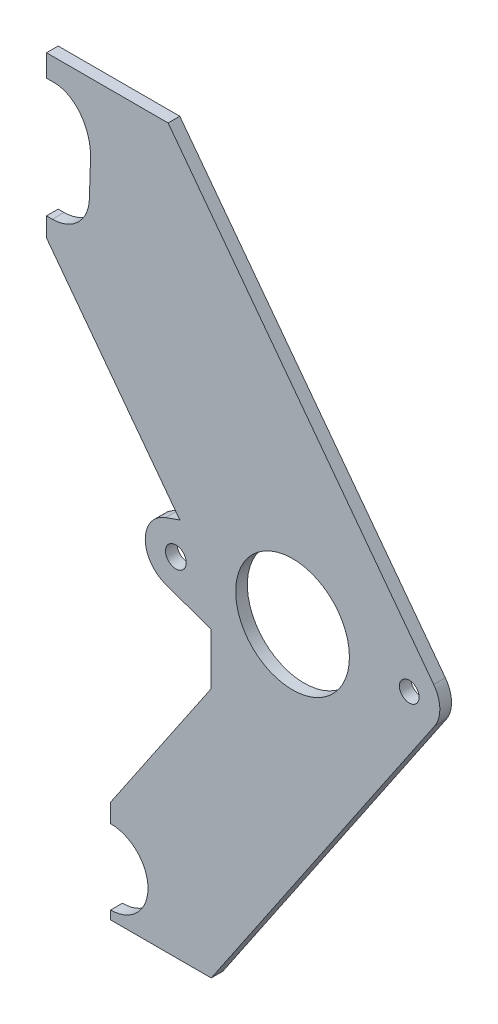
ISO-10303-21;
HEADER;
FILE_DESCRIPTION(('STEP AP214'),'2;1');
FILE_NAME('part.step','',(''),(''),'','','');
FILE_SCHEMA(('AUTOMOTIVE_DESIGN { 1 0 10303 214 1 1 1 1 }'));
ENDSEC;
DATA;
#1=APPLICATION_CONTEXT('core data for automotive mechanical design processes');
#2=APPLICATION_PROTOCOL_DEFINITION('international standard','automotive_design',2000,#1);
#3=PRODUCT_CONTEXT('',#1,'mechanical');
#4=PRODUCT('Part','Part','',(#3));
#5=PRODUCT_RELATED_PRODUCT_CATEGORY('part','',(#4));
#6=PRODUCT_DEFINITION_FORMATION('','',#4);
#7=PRODUCT_DEFINITION_CONTEXT('part definition',#1,'design');
#8=PRODUCT_DEFINITION('design','',#6,#7);
#9=PRODUCT_DEFINITION_SHAPE('','',#8);
#10=(LENGTH_UNIT() NAMED_UNIT(*) SI_UNIT(.MILLI.,.METRE.));
#11=(NAMED_UNIT(*) PLANE_ANGLE_UNIT() SI_UNIT($,.RADIAN.));
#12=(NAMED_UNIT(*) SI_UNIT($,.STERADIAN.) SOLID_ANGLE_UNIT());
#13=UNCERTAINTY_MEASURE_WITH_UNIT(LENGTH_MEASURE(1.E-05),#10,'distance_accuracy_value','');
#14=(GEOMETRIC_REPRESENTATION_CONTEXT(3) GLOBAL_UNCERTAINTY_ASSIGNED_CONTEXT((#13)) GLOBAL_UNIT_ASSIGNED_CONTEXT((#10,
#11,#12)) REPRESENTATION_CONTEXT('',''));
#15=CARTESIAN_POINT('',(0.,0.,0.));
#16=DIRECTION('',(0.,0.,1.));
#17=DIRECTION('',(1.,0.,0.));
#18=AXIS2_PLACEMENT_3D('',#15,#16,#17);
#19=CARTESIAN_POINT('',(-84.35,0.,4.));
#20=DIRECTION('',(1.,0.,0.));
#21=DIRECTION('',(0.,1.,0.));
#22=AXIS2_PLACEMENT_3D('',#19,#20,#21);
#23=PLANE('',#22);
#24=DIRECTION('',(0.,-1.,0.));
#25=VECTOR('',#24,1.);
#26=CARTESIAN_POINT('',(-84.35,0.,4.));
#27=LINE('',#26,#25);
#28=CARTESIAN_POINT('',(-84.35,79.0815375980178,4.));
#29=VERTEX_POINT('',#28);
#30=CARTESIAN_POINT('',(-84.35,72.5,4.));
#31=VERTEX_POINT('',#30);
#32=EDGE_CURVE('E471',#29,#31,#27,.T.);
#33=ORIENTED_EDGE('',*,*,#32,.F.);
#34=DIRECTION('',(0.,0.,-1.));
#35=VECTOR('',#34,1.);
#36=CARTESIAN_POINT('',(-84.35,79.0815375980178,47.6736507811537));
#37=LINE('',#36,#35);
#38=CARTESIAN_POINT('',(-84.35,79.0815375980178,0.));
#39=VERTEX_POINT('',#38);
#40=EDGE_CURVE('E333',#29,#39,#37,.T.);
#41=ORIENTED_EDGE('',*,*,#40,.T.);
#42=DIRECTION('',(0.,-1.,0.));
#43=VECTOR('',#42,1.);
#44=CARTESIAN_POINT('',(-84.35,0.,0.));
#45=LINE('',#44,#43);
#46=CARTESIAN_POINT('',(-84.35,72.5,0.));
#47=VERTEX_POINT('',#46);
#48=EDGE_CURVE('E211',#39,#47,#45,.T.);
#49=ORIENTED_EDGE('',*,*,#48,.T.);
#50=DIRECTION('',(0.,0.,-1.));
#51=VECTOR('',#50,1.);
#52=CARTESIAN_POINT('',(-84.35,72.5,4.));
#53=LINE('',#52,#51);
#54=EDGE_CURVE('E269',#31,#47,#53,.T.);
#55=ORIENTED_EDGE('',*,*,#54,.F.);
#56=EDGE_LOOP('',(#33,#41,#49,#55));
#57=FACE_BOUND('',#56,.T.);
#58=ADVANCED_FACE('F41',(#57),#23,.F.);
#59=CARTESIAN_POINT('',(40.,0.,4.));
#60=DIRECTION('',(0.,0.,-1.));
#61=DIRECTION('',(-1.,0.,0.));
#62=AXIS2_PLACEMENT_3D('',#59,#60,#61);
#63=CYLINDRICAL_SURFACE('',#62,10.5);
#64=CARTESIAN_POINT('',(40.,0.,0.));
#65=DIRECTION('',(0.,0.,1.));
#66=DIRECTION('',(1.,0.,0.));
#67=AXIS2_PLACEMENT_3D('',#64,#65,#66);
#68=CIRCLE('',#67,10.5);
#69=CARTESIAN_POINT('',(48.694184993014,-5.88737185060105,0.));
#70=VERTEX_POINT('',#69);
#71=CARTESIAN_POINT('',(48.3950002922509,6.30666077200194,0.));
#72=VERTEX_POINT('',#71);
#73=EDGE_CURVE('E201',#70,#72,#68,.T.);
#74=ORIENTED_EDGE('',*,*,#73,.T.);
#75=DIRECTION('',(0.,0.,-1.));
#76=VECTOR('',#75,1.);
#77=CARTESIAN_POINT('',(48.3950002922509,6.30666077200194,4.));
#78=LINE('',#77,#76);
#79=CARTESIAN_POINT('',(48.3950002922509,6.30666077200194,4.));
#80=VERTEX_POINT('',#79);
#81=EDGE_CURVE('E11',#80,#72,#78,.T.);
#82=ORIENTED_EDGE('',*,*,#81,.F.);
#83=CARTESIAN_POINT('',(40.,0.,4.));
#84=DIRECTION('',(0.,0.,1.));
#85=DIRECTION('',(1.,0.,0.));
#86=AXIS2_PLACEMENT_3D('',#83,#84,#85);
#87=CIRCLE('',#86,10.5);
#88=CARTESIAN_POINT('',(48.694184993014,-5.88737185060105,4.));
#89=VERTEX_POINT('',#88);
#90=EDGE_CURVE('E124',#89,#80,#87,.T.);
#91=ORIENTED_EDGE('',*,*,#90,.F.);
#92=DIRECTION('',(0.,0.,-1.));
#93=VECTOR('',#92,1.);
#94=CARTESIAN_POINT('',(48.694184993014,-5.88737185060105,4.));
#95=LINE('',#94,#93);
#96=EDGE_CURVE('E200',#89,#70,#95,.T.);
#97=ORIENTED_EDGE('',*,*,#96,.T.);
#98=EDGE_LOOP('',(#74,#82,#91,#97));
#99=FACE_BOUND('',#98,.T.);
#100=ADVANCED_FACE('F43',(#99),#63,.T.);
#101=CARTESIAN_POINT('',(33.9645349523477,25.5155202818734,4.));
#102=DIRECTION('',(0.799523837357224,0.60063435923828,0.));
#103=DIRECTION('',(-0.60063435923828,0.799523837357224,0.));
#104=AXIS2_PLACEMENT_3D('',#101,#102,#103);
#105=PLANE('',#104);
#106=DIRECTION('',(0.60063435923828,-0.799523837357224,0.));
#107=VECTOR('',#106,1.);
#108=CARTESIAN_POINT('',(33.9645349523477,25.5155202818734,0.));
#109=LINE('',#108,#107);
#110=CARTESIAN_POINT('',(-42.6502947320582,127.5,0.));
#111=VERTEX_POINT('',#110);
#112=EDGE_CURVE('E204',#111,#72,#109,.T.);
#113=ORIENTED_EDGE('',*,*,#112,.F.);
#114=DIRECTION('',(0.,0.,-1.));
#115=VECTOR('',#114,1.);
#116=CARTESIAN_POINT('',(-42.6502947320582,127.5,4.));
#117=LINE('',#116,#115);
#118=CARTESIAN_POINT('',(-42.6502947320582,127.5,4.));
#119=VERTEX_POINT('',#118);
#120=EDGE_CURVE('E49',#119,#111,#117,.T.);
#121=ORIENTED_EDGE('',*,*,#120,.F.);
#122=DIRECTION('',(0.60063435923828,-0.799523837357224,0.));
#123=VECTOR('',#122,1.);
#124=CARTESIAN_POINT('',(33.9645349523477,25.5155202818734,4.));
#125=LINE('',#124,#123);
#126=EDGE_CURVE('E476',#119,#80,#125,.T.);
#127=ORIENTED_EDGE('',*,*,#126,.T.);
#128=ORIENTED_EDGE('',*,*,#81,.T.);
#129=EDGE_LOOP('',(#113,#121,#127,#128));
#130=FACE_BOUND('',#129,.T.);
#131=ADVANCED_FACE('F282',(#130),#105,.T.);
#132=CARTESIAN_POINT('',(0.,127.5,4.));
#133=DIRECTION('',(0.,1.,0.));
#134=DIRECTION('',(0.,0.,1.));
#135=AXIS2_PLACEMENT_3D('',#132,#133,#134);
#136=PLANE('',#135);
#137=DIRECTION('',(1.,0.,0.));
#138=VECTOR('',#137,1.);
#139=CARTESIAN_POINT('',(0.,127.5,0.));
#140=LINE('',#139,#138);
#141=CARTESIAN_POINT('',(-84.35,127.5,0.));
#142=VERTEX_POINT('',#141);
#143=EDGE_CURVE('E208',#142,#111,#140,.T.);
#144=ORIENTED_EDGE('',*,*,#143,.F.);
#145=DIRECTION('',(0.,0.,-1.));
#146=VECTOR('',#145,1.);
#147=CARTESIAN_POINT('',(-84.35,127.5,4.));
#148=LINE('',#147,#146);
#149=CARTESIAN_POINT('',(-84.35,127.5,4.));
#150=VERTEX_POINT('',#149);
#151=EDGE_CURVE('E272',#150,#142,#148,.T.);
#152=ORIENTED_EDGE('',*,*,#151,.F.);
#153=DIRECTION('',(1.,0.,0.));
#154=VECTOR('',#153,1.);
#155=CARTESIAN_POINT('',(0.,127.5,4.));
#156=LINE('',#155,#154);
#157=EDGE_CURVE('E279',#150,#119,#156,.T.);
#158=ORIENTED_EDGE('',*,*,#157,.T.);
#159=ORIENTED_EDGE('',*,*,#120,.T.);
#160=EDGE_LOOP('',(#144,#152,#158,#159));
#161=FACE_BOUND('',#160,.T.);
#162=ADVANCED_FACE('F277',(#161),#136,.T.);
#163=CARTESIAN_POINT('',(-84.35,119.944066118499,0.));
#164=VERTEX_POINT('',#163);
#165=EDGE_CURVE('E212',#142,#164,#45,.T.);
#166=ORIENTED_EDGE('',*,*,#165,.T.);
#167=DIRECTION('',(0.,0.,-1.));
#168=VECTOR('',#167,1.);
#169=CARTESIAN_POINT('',(-84.35,119.944066118499,47.6736507811537));
#170=LINE('',#169,#168);
#171=CARTESIAN_POINT('',(-84.35,119.944066118499,4.));
#172=VERTEX_POINT('',#171);
#173=EDGE_CURVE('E300',#172,#164,#170,.T.);
#174=ORIENTED_EDGE('',*,*,#173,.F.);
#175=EDGE_CURVE('E473',#150,#172,#27,.T.);
#176=ORIENTED_EDGE('',*,*,#175,.F.);
#177=ORIENTED_EDGE('',*,*,#151,.T.);
#178=EDGE_LOOP('',(#166,#174,#176,#177));
#179=FACE_BOUND('',#178,.T.);
#180=ADVANCED_FACE('F296',(#179),#23,.F.);
#181=CARTESIAN_POINT('',(-19.1036983528371,-14.351464062867,4.));
#182=DIRECTION('',(0.799523837357224,0.60063435923828,0.));
#183=DIRECTION('',(-0.60063435923828,0.799523837357224,0.));
#184=AXIS2_PLACEMENT_3D('',#181,#182,#183);
#185=PLANE('',#184);
#186=DIRECTION('',(0.60063435923828,-0.799523837357224,0.));
#187=VECTOR('',#186,1.);
#188=CARTESIAN_POINT('',(-19.1036983528371,-14.351464062867,0.));
#189=LINE('',#188,#187);
#190=CARTESIAN_POINT('',(-38.6329893227357,11.6446072856333,0.));
#191=VERTEX_POINT('',#190);
#192=EDGE_CURVE('E215',#47,#191,#189,.T.);
#193=ORIENTED_EDGE('',*,*,#192,.T.);
#194=DIRECTION('',(0.,0.,-1.));
#195=VECTOR('',#194,1.);
#196=CARTESIAN_POINT('',(-38.6329893227357,11.6446072856333,4.));
#197=LINE('',#196,#195);
#198=CARTESIAN_POINT('',(-38.6329893227357,11.6446072856333,4.));
#199=VERTEX_POINT('',#198);
#200=EDGE_CURVE('E266',#199,#191,#197,.T.);
#201=ORIENTED_EDGE('',*,*,#200,.F.);
#202=DIRECTION('',(0.60063435923828,-0.799523837357224,0.));
#203=VECTOR('',#202,1.);
#204=CARTESIAN_POINT('',(-19.1036983528371,-14.351464062867,4.));
#205=LINE('',#204,#203);
#206=EDGE_CURVE('E475',#31,#199,#205,.T.);
#207=ORIENTED_EDGE('',*,*,#206,.F.);
#208=ORIENTED_EDGE('',*,*,#54,.T.);
#209=EDGE_LOOP('',(#193,#201,#207,#208));
#210=FACE_BOUND('',#209,.T.);
#211=ADVANCED_FACE('F451',(#210),#185,.F.);
#212=CARTESIAN_POINT('',(-8.1,22.5918126762772,4.));
#213=DIRECTION('',(0.3375,-0.941325528178217,0.));
#214=DIRECTION('',(0.941325528178217,0.3375,0.));
#215=AXIS2_PLACEMENT_3D('',#212,#213,#214);
#216=PLANE('',#215);
#217=DIRECTION('',(-0.941325528178217,-0.3375,0.));
#218=VECTOR('',#217,1.);
#219=CARTESIAN_POINT('',(-8.1,22.5918126762772,0.));
#220=LINE('',#219,#218);
#221=CARTESIAN_POINT('',(-43.54375,9.88391804587128,0.));
#222=VERTEX_POINT('',#221);
#223=EDGE_CURVE('E217',#191,#222,#220,.T.);
#224=ORIENTED_EDGE('',*,*,#223,.T.);
#225=DIRECTION('',(0.,0.,-1.));
#226=VECTOR('',#225,1.);
#227=CARTESIAN_POINT('',(-43.54375,9.88391804587128,4.));
#228=LINE('',#227,#226);
#229=CARTESIAN_POINT('',(-43.54375,9.88391804587128,4.));
#230=VERTEX_POINT('',#229);
#231=EDGE_CURVE('E263',#230,#222,#228,.T.);
#232=ORIENTED_EDGE('',*,*,#231,.F.);
#233=DIRECTION('',(-0.941325528178217,-0.3375,0.));
#234=VECTOR('',#233,1.);
#235=CARTESIAN_POINT('',(-8.1,22.5918126762772,4.));
#236=LINE('',#235,#234);
#237=EDGE_CURVE('E480',#199,#230,#236,.T.);
#238=ORIENTED_EDGE('',*,*,#237,.F.);
#239=ORIENTED_EDGE('',*,*,#200,.T.);
#240=EDGE_LOOP('',(#224,#232,#238,#239));
#241=FACE_BOUND('',#240,.T.);
#242=ADVANCED_FACE('F447',(#241),#216,.F.);
#243=CARTESIAN_POINT('',(-40.,0.,4.));
#244=DIRECTION('',(0.,0.,-1.));
#245=DIRECTION('',(-1.,0.,0.));
#246=AXIS2_PLACEMENT_3D('',#243,#244,#245);
#247=CYLINDRICAL_SURFACE('',#246,10.5);
#248=CARTESIAN_POINT('',(-40.,0.,0.));
#249=DIRECTION('',(0.,0.,1.));
#250=DIRECTION('',(1.,0.,0.));
#251=AXIS2_PLACEMENT_3D('',#248,#249,#250);
#252=CIRCLE('',#251,10.5);
#253=CARTESIAN_POINT('',(-43.54375,-9.88391804587129,0.));
#254=VERTEX_POINT('',#253);
#255=EDGE_CURVE('E219',#222,#254,#252,.T.);
#256=ORIENTED_EDGE('',*,*,#255,.T.);
#257=DIRECTION('',(0.,0.,-1.));
#258=VECTOR('',#257,1.);
#259=CARTESIAN_POINT('',(-43.54375,-9.88391804587129,4.));
#260=LINE('',#259,#258);
#261=CARTESIAN_POINT('',(-43.54375,-9.88391804587129,4.));
#262=VERTEX_POINT('',#261);
#263=EDGE_CURVE('E260',#262,#254,#260,.T.);
#264=ORIENTED_EDGE('',*,*,#263,.F.);
#265=CARTESIAN_POINT('',(-40.,0.,4.));
#266=DIRECTION('',(0.,0.,1.));
#267=DIRECTION('',(1.,0.,0.));
#268=AXIS2_PLACEMENT_3D('',#265,#266,#267);
#269=CIRCLE('',#268,10.5);
#270=EDGE_CURVE('E482',#230,#262,#269,.T.);
#271=ORIENTED_EDGE('',*,*,#270,.F.);
#272=ORIENTED_EDGE('',*,*,#231,.T.);
#273=EDGE_LOOP('',(#256,#264,#271,#272));
#274=FACE_BOUND('',#273,.T.);
#275=ADVANCED_FACE('F443',(#274),#247,.T.);
#276=CARTESIAN_POINT('',(-8.09999999999999,-22.5918126762772,4.));
#277=DIRECTION('',(0.3375,0.941325528178218,0.));
#278=DIRECTION('',(-0.941325528178218,0.3375,0.));
#279=AXIS2_PLACEMENT_3D('',#276,#277,#278);
#280=PLANE('',#279);
#281=DIRECTION('',(0.941325528178218,-0.3375,0.));
#282=VECTOR('',#281,1.);
#283=CARTESIAN_POINT('',(-8.09999999999999,-22.5918126762772,0.));
#284=LINE('',#283,#282);
#285=CARTESIAN_POINT('',(-27.8814867049405,-15.4994184268211,0.));
#286=VERTEX_POINT('',#285);
#287=EDGE_CURVE('E221',#254,#286,#284,.T.);
#288=ORIENTED_EDGE('',*,*,#287,.T.);
#289=DIRECTION('',(0.,0.,-1.));
#290=VECTOR('',#289,1.);
#291=CARTESIAN_POINT('',(-27.8814867049405,-15.4994184268211,4.));
#292=LINE('',#291,#290);
#293=CARTESIAN_POINT('',(-27.8814867049405,-15.4994184268211,4.));
#294=VERTEX_POINT('',#293);
#295=EDGE_CURVE('E258',#294,#286,#292,.T.);
#296=ORIENTED_EDGE('',*,*,#295,.F.);
#297=DIRECTION('',(0.941325528178218,-0.3375,0.));
#298=VECTOR('',#297,1.);
#299=CARTESIAN_POINT('',(-8.09999999999999,-22.5918126762772,4.));
#300=LINE('',#299,#298);
#301=EDGE_CURVE('E484',#262,#294,#300,.T.);
#302=ORIENTED_EDGE('',*,*,#301,.F.);
#303=ORIENTED_EDGE('',*,*,#263,.T.);
#304=EDGE_LOOP('',(#288,#296,#302,#303));
#305=FACE_BOUND('',#304,.T.);
#306=ADVANCED_FACE('F439',(#305),#280,.F.);
#307=CARTESIAN_POINT('',(-27.8814867049405,0.,4.));
#308=DIRECTION('',(-1.,0.,0.));
#309=DIRECTION('',(0.,0.,1.));
#310=AXIS2_PLACEMENT_3D('',#307,#308,#309);
#311=PLANE('',#310);
#312=DIRECTION('',(0.,1.,0.));
#313=VECTOR('',#312,1.);
#314=CARTESIAN_POINT('',(-27.8814867049405,0.,0.));
#315=LINE('',#314,#313);
#316=CARTESIAN_POINT('',(-27.8814867049405,-33.0691796206567,0.));
#317=VERTEX_POINT('',#316);
#318=EDGE_CURVE('E224',#317,#286,#315,.T.);
#319=ORIENTED_EDGE('',*,*,#318,.F.);
#320=DIRECTION('',(0.,0.,-1.));
#321=VECTOR('',#320,1.);
#322=CARTESIAN_POINT('',(-27.8814867049405,-33.0691796206567,4.));
#323=LINE('',#322,#321);
#324=CARTESIAN_POINT('',(-27.8814867049405,-33.0691796206567,4.));
#325=VERTEX_POINT('',#324);
#326=EDGE_CURVE('E256',#325,#317,#323,.T.);
#327=ORIENTED_EDGE('',*,*,#326,.F.);
#328=DIRECTION('',(0.,1.,0.));
#329=VECTOR('',#328,1.);
#330=CARTESIAN_POINT('',(-27.8814867049405,0.,4.));
#331=LINE('',#330,#329);
#332=EDGE_CURVE('E486',#325,#294,#331,.T.);
#333=ORIENTED_EDGE('',*,*,#332,.T.);
#334=ORIENTED_EDGE('',*,*,#295,.T.);
#335=EDGE_LOOP('',(#319,#327,#333,#334));
#336=FACE_BOUND('',#335,.T.);
#337=ADVANCED_FACE('F435',(#336),#311,.T.);
#338=CARTESIAN_POINT('',(-3.76284689815124,2.54805699718811,4.));
#339=DIRECTION('',(-0.828017618382287,0.560702081009627,0.));
#340=DIRECTION('',(-0.560702081009627,-0.828017618382287,0.));
#341=AXIS2_PLACEMENT_3D('',#338,#339,#340);
#342=PLANE('',#341);
#343=DIRECTION('',(0.560702081009627,0.828017618382287,0.));
#344=VECTOR('',#343,1.);
#345=CARTESIAN_POINT('',(-3.76284689815124,2.54805699718811,0.));
#346=LINE('',#345,#344);
#347=CARTESIAN_POINT('',(-62.35,-83.9706070531389,0.));
#348=VERTEX_POINT('',#347);
#349=EDGE_CURVE('E227',#348,#317,#346,.T.);
#350=ORIENTED_EDGE('',*,*,#349,.F.);
#351=DIRECTION('',(0.,0.,-1.));
#352=VECTOR('',#351,1.);
#353=CARTESIAN_POINT('',(-62.35,-83.9706070531389,4.));
#354=LINE('',#353,#352);
#355=CARTESIAN_POINT('',(-62.35,-83.9706070531389,4.));
#356=VERTEX_POINT('',#355);
#357=EDGE_CURVE('E254',#356,#348,#354,.T.);
#358=ORIENTED_EDGE('',*,*,#357,.F.);
#359=DIRECTION('',(0.560702081009627,0.828017618382287,0.));
#360=VECTOR('',#359,1.);
#361=CARTESIAN_POINT('',(-3.76284689815124,2.54805699718811,4.));
#362=LINE('',#361,#360);
#363=EDGE_CURVE('E489',#356,#325,#362,.T.);
#364=ORIENTED_EDGE('',*,*,#363,.T.);
#365=ORIENTED_EDGE('',*,*,#326,.T.);
#366=EDGE_LOOP('',(#350,#358,#364,#365));
#367=FACE_BOUND('',#366,.T.);
#368=ADVANCED_FACE('F431',(#367),#342,.T.);
#369=CARTESIAN_POINT('',(-62.3499999999998,1.34372925671358E-13,4.));
#370=DIRECTION('',(1.,0.,0.));
#371=DIRECTION('',(0.,1.,0.));
#372=AXIS2_PLACEMENT_3D('',#369,#370,#371);
#373=PLANE('',#372);
#374=DIRECTION('',(0.,-1.,0.));
#375=VECTOR('',#374,1.);
#376=CARTESIAN_POINT('',(-62.3499999999998,1.34372925671358E-13,0.));
#377=LINE('',#376,#375);
#378=CARTESIAN_POINT('',(-62.35,-90.41,0.));
#379=VERTEX_POINT('',#378);
#380=EDGE_CURVE('E230',#348,#379,#377,.T.);
#381=ORIENTED_EDGE('',*,*,#380,.T.);
#382=DIRECTION('',(0.,0.,-1.));
#383=VECTOR('',#382,1.);
#384=CARTESIAN_POINT('',(-62.35,-90.41,4.));
#385=LINE('',#384,#383);
#386=CARTESIAN_POINT('',(-62.35,-90.41,4.));
#387=VERTEX_POINT('',#386);
#388=EDGE_CURVE('E252',#387,#379,#385,.T.);
#389=ORIENTED_EDGE('',*,*,#388,.F.);
#390=DIRECTION('',(0.,-1.,0.));
#391=VECTOR('',#390,1.);
#392=CARTESIAN_POINT('',(-62.3499999999998,1.34372925671358E-13,4.));
#393=LINE('',#392,#391);
#394=EDGE_CURVE('E492',#356,#387,#393,.T.);
#395=ORIENTED_EDGE('',*,*,#394,.F.);
#396=ORIENTED_EDGE('',*,*,#357,.T.);
#397=EDGE_LOOP('',(#381,#389,#395,#396));
#398=FACE_BOUND('',#397,.T.);
#399=ADVANCED_FACE('F427',(#398),#373,.F.);
#400=CARTESIAN_POINT('',(-62.35,-103.21,4.));
#401=DIRECTION('',(0.,0.,-1.));
#402=DIRECTION('',(-1.,0.,0.));
#403=AXIS2_PLACEMENT_3D('',#400,#401,#402);
#404=CYLINDRICAL_SURFACE('',#403,12.8);
#405=CARTESIAN_POINT('',(-62.35,-103.21,0.));
#406=DIRECTION('',(0.,0.,1.));
#407=DIRECTION('',(1.,0.,0.));
#408=AXIS2_PLACEMENT_3D('',#405,#406,#407);
#409=CIRCLE('',#408,12.8);
#410=CARTESIAN_POINT('',(-62.35,-116.01,0.));
#411=VERTEX_POINT('',#410);
#412=EDGE_CURVE('E233',#411,#379,#409,.T.);
#413=ORIENTED_EDGE('',*,*,#412,.F.);
#414=DIRECTION('',(0.,0.,-1.));
#415=VECTOR('',#414,1.);
#416=CARTESIAN_POINT('',(-62.35,-116.01,4.));
#417=LINE('',#416,#415);
#418=CARTESIAN_POINT('',(-62.35,-116.01,4.));
#419=VERTEX_POINT('',#418);
#420=EDGE_CURVE('E183',#419,#411,#417,.T.);
#421=ORIENTED_EDGE('',*,*,#420,.F.);
#422=CARTESIAN_POINT('',(-62.35,-103.21,4.));
#423=DIRECTION('',(0.,0.,1.));
#424=DIRECTION('',(1.,0.,0.));
#425=AXIS2_PLACEMENT_3D('',#422,#423,#424);
#426=CIRCLE('',#425,12.8);
#427=EDGE_CURVE('E173',#419,#387,#426,.T.);
#428=ORIENTED_EDGE('',*,*,#427,.T.);
#429=ORIENTED_EDGE('',*,*,#388,.T.);
#430=EDGE_LOOP('',(#413,#421,#428,#429));
#431=FACE_BOUND('',#430,.T.);
#432=ADVANCED_FACE('F424',(#431),#404,.F.);
#433=CARTESIAN_POINT('',(-62.35,0.,4.));
#434=DIRECTION('',(1.,0.,0.));
#435=DIRECTION('',(0.,0.,-1.));
#436=AXIS2_PLACEMENT_3D('',#433,#434,#435);
#437=PLANE('',#436);
#438=DIRECTION('',(0.,-1.,0.));
#439=VECTOR('',#438,1.);
#440=CARTESIAN_POINT('',(-62.35,0.,0.));
#441=LINE('',#440,#439);
#442=CARTESIAN_POINT('',(-62.35,-118.970607053139,0.));
#443=VERTEX_POINT('',#442);
#444=EDGE_CURVE('E180',#411,#443,#441,.T.);
#445=ORIENTED_EDGE('',*,*,#444,.T.);
#446=DIRECTION('',(0.,0.,-1.));
#447=VECTOR('',#446,1.);
#448=CARTESIAN_POINT('',(-62.35,-118.970607053139,4.));
#449=LINE('',#448,#447);
#450=CARTESIAN_POINT('',(-62.35,-118.970607053139,4.));
#451=VERTEX_POINT('',#450);
#452=EDGE_CURVE('E177',#451,#443,#449,.T.);
#453=ORIENTED_EDGE('',*,*,#452,.F.);
#454=DIRECTION('',(0.,-1.,0.));
#455=VECTOR('',#454,1.);
#456=CARTESIAN_POINT('',(-62.35,0.,4.));
#457=LINE('',#456,#455);
#458=EDGE_CURVE('E164',#419,#451,#457,.T.);
#459=ORIENTED_EDGE('',*,*,#458,.F.);
#460=ORIENTED_EDGE('',*,*,#420,.T.);
#461=EDGE_LOOP('',(#445,#453,#459,#460));
#462=FACE_BOUND('',#461,.T.);
#463=ADVANCED_FACE('F178',(#462),#437,.F.);
#464=CARTESIAN_POINT('',(0.,-118.970607053139,4.));
#465=DIRECTION('',(0.,1.,0.));
#466=DIRECTION('',(0.,0.,1.));
#467=AXIS2_PLACEMENT_3D('',#464,#465,#466);
#468=PLANE('',#467);
#469=DIRECTION('',(1.,0.,0.));
#470=VECTOR('',#469,1.);
#471=CARTESIAN_POINT('',(0.,-118.970607053139,0.));
#472=LINE('',#471,#470);
#473=CARTESIAN_POINT('',(-27.8814867049405,-118.970607053139,0.));
#474=VERTEX_POINT('',#473);
#475=EDGE_CURVE('E237',#443,#474,#472,.T.);
#476=ORIENTED_EDGE('',*,*,#475,.T.);
#477=DIRECTION('',(0.,0.,-1.));
#478=VECTOR('',#477,1.);
#479=CARTESIAN_POINT('',(-27.8814867049405,-118.970607053139,4.));
#480=LINE('',#479,#478);
#481=CARTESIAN_POINT('',(-27.8814867049405,-118.970607053139,4.));
#482=VERTEX_POINT('',#481);
#483=EDGE_CURVE('E184',#482,#474,#480,.T.);
#484=ORIENTED_EDGE('',*,*,#483,.F.);
#485=DIRECTION('',(1.,0.,0.));
#486=VECTOR('',#485,1.);
#487=CARTESIAN_POINT('',(0.,-118.970607053139,4.));
#488=LINE('',#487,#486);
#489=EDGE_CURVE('E170',#451,#482,#488,.T.);
#490=ORIENTED_EDGE('',*,*,#489,.F.);
#491=ORIENTED_EDGE('',*,*,#452,.T.);
#492=EDGE_LOOP('',(#476,#484,#490,#491));
#493=FACE_BOUND('',#492,.T.);
#494=ADVANCED_FACE('F186',(#493),#468,.F.);
#495=CARTESIAN_POINT('',(40.,0.,4.));
#496=DIRECTION('',(0.,0.,-1.));
#497=DIRECTION('',(-1.,0.,0.));
#498=AXIS2_PLACEMENT_3D('',#495,#496,#497);
#499=CYLINDRICAL_SURFACE('',#498,3.38649040091264);
#500=CARTESIAN_POINT('',(40.,0.,4.));
#501=DIRECTION('',(0.,0.,1.));
#502=DIRECTION('',(1.,0.,0.));
#503=AXIS2_PLACEMENT_3D('',#500,#501,#502);
#504=CIRCLE('',#503,3.38649040091264);
#505=CARTESIAN_POINT('',(43.3864904009126,0.,4.));
#506=VERTEX_POINT('',#505);
#507=EDGE_CURVE('E194',#506,#506,#504,.T.);
#508=ORIENTED_EDGE('',*,*,#507,.T.);
#509=EDGE_LOOP('',(#508));
#510=FACE_BOUND('',#509,.T.);
#511=CARTESIAN_POINT('',(40.,0.,0.));
#512=DIRECTION('',(0.,0.,1.));
#513=DIRECTION('',(1.,0.,0.));
#514=AXIS2_PLACEMENT_3D('',#511,#512,#513);
#515=CIRCLE('',#514,3.38649040091264);
#516=CARTESIAN_POINT('',(43.3864904009126,0.,0.));
#517=VERTEX_POINT('',#516);
#518=EDGE_CURVE('E243',#517,#517,#515,.T.);
#519=ORIENTED_EDGE('',*,*,#518,.F.);
#520=EDGE_LOOP('',(#519));
#521=FACE_BOUND('',#520,.T.);
#522=ADVANCED_FACE('F410',(#510,#521),#499,.F.);
#523=CARTESIAN_POINT('',(-40.,0.,4.));
#524=DIRECTION('',(0.,0.,-1.));
#525=DIRECTION('',(-1.,0.,0.));
#526=AXIS2_PLACEMENT_3D('',#523,#524,#525);
#527=CYLINDRICAL_SURFACE('',#526,3.56576924525574);
#528=CARTESIAN_POINT('',(-40.,0.,4.));
#529=DIRECTION('',(0.,0.,1.));
#530=DIRECTION('',(1.,0.,0.));
#531=AXIS2_PLACEMENT_3D('',#528,#529,#530);
#532=CIRCLE('',#531,3.56576924525574);
#533=CARTESIAN_POINT('',(-36.4342307547443,0.,4.));
#534=VERTEX_POINT('',#533);
#535=EDGE_CURVE('E188',#534,#534,#532,.T.);
#536=ORIENTED_EDGE('',*,*,#535,.T.);
#537=EDGE_LOOP('',(#536));
#538=FACE_BOUND('',#537,.T.);
#539=CARTESIAN_POINT('',(-40.,0.,0.));
#540=DIRECTION('',(0.,0.,1.));
#541=DIRECTION('',(1.,0.,0.));
#542=AXIS2_PLACEMENT_3D('',#539,#540,#541);
#543=CIRCLE('',#542,3.56576924525574);
#544=CARTESIAN_POINT('',(-36.4342307547443,0.,0.));
#545=VERTEX_POINT('',#544);
#546=EDGE_CURVE('E240',#545,#545,#543,.T.);
#547=ORIENTED_EDGE('',*,*,#546,.F.);
#548=EDGE_LOOP('',(#547));
#549=FACE_BOUND('',#548,.T.);
#550=ADVANCED_FACE('F413',(#538,#549),#527,.F.);
#551=CARTESIAN_POINT('',(36.1187120470729,-24.4582199201844,4.));
#552=DIRECTION('',(-0.828017618382286,0.560702081009627,0.));
#553=DIRECTION('',(-0.560702081009627,-0.828017618382286,0.));
#554=AXIS2_PLACEMENT_3D('',#551,#552,#553);
#555=PLANE('',#554);
#556=DIRECTION('',(0.560702081009627,0.828017618382286,0.));
#557=VECTOR('',#556,1.);
#558=CARTESIAN_POINT('',(36.1187120470729,-24.4582199201844,0.));
#559=LINE('',#558,#557);
#560=EDGE_CURVE('E118',#474,#70,#559,.T.);
#561=ORIENTED_EDGE('',*,*,#560,.T.);
#562=ORIENTED_EDGE('',*,*,#96,.F.);
#563=DIRECTION('',(0.560702081009627,0.828017618382286,0.));
#564=VECTOR('',#563,1.);
#565=CARTESIAN_POINT('',(36.1187120470729,-24.4582199201844,4.));
#566=LINE('',#565,#564);
#567=EDGE_CURVE('E65',#482,#89,#566,.T.);
#568=ORIENTED_EDGE('',*,*,#567,.F.);
#569=ORIENTED_EDGE('',*,*,#483,.T.);
#570=EDGE_LOOP('',(#561,#562,#568,#569));
#571=FACE_BOUND('',#570,.T.);
#572=ADVANCED_FACE('F408',(#571),#555,.F.);
#573=CARTESIAN_POINT('',(0.,0.,4.));
#574=DIRECTION('',(0.,0.,-1.));
#575=DIRECTION('',(-1.,0.,0.));
#576=AXIS2_PLACEMENT_3D('',#573,#574,#575);
#577=CYLINDRICAL_SURFACE('',#576,19.5);
#578=CARTESIAN_POINT('',(0.,0.,4.));
#579=DIRECTION('',(0.,0.,1.));
#580=DIRECTION('',(1.,0.,0.));
#581=AXIS2_PLACEMENT_3D('',#578,#579,#580);
#582=CIRCLE('',#581,19.5);
#583=CARTESIAN_POINT('',(19.5,0.,4.));
#584=VERTEX_POINT('',#583);
#585=EDGE_CURVE('E197',#584,#584,#582,.T.);
#586=ORIENTED_EDGE('',*,*,#585,.T.);
#587=EDGE_LOOP('',(#586));
#588=FACE_BOUND('',#587,.T.);
#589=CARTESIAN_POINT('',(0.,0.,0.));
#590=DIRECTION('',(0.,0.,1.));
#591=DIRECTION('',(1.,0.,0.));
#592=AXIS2_PLACEMENT_3D('',#589,#590,#591);
#593=CIRCLE('',#592,19.5);
#594=CARTESIAN_POINT('',(19.5,0.,0.));
#595=VERTEX_POINT('',#594);
#596=EDGE_CURVE('E246',#595,#595,#593,.T.);
#597=ORIENTED_EDGE('',*,*,#596,.F.);
#598=EDGE_LOOP('',(#597));
#599=FACE_BOUND('',#598,.T.);
#600=ADVANCED_FACE('F403',(#588,#599),#577,.F.);
#601=CARTESIAN_POINT('',(0.,0.,4.));
#602=DIRECTION('',(0.,0.,1.));
#603=DIRECTION('',(1.,0.,0.));
#604=AXIS2_PLACEMENT_3D('',#601,#602,#603);
#605=PLANE('',#604);
#606=DIRECTION('',(-1.,0.,0.));
#607=VECTOR('',#606,1.);
#608=CARTESIAN_POINT('',(-82.35,79.0815375980178,4.));
#609=LINE('',#608,#607);
#610=CARTESIAN_POINT('',(-82.35,79.0815375980178,4.));
#611=VERTEX_POINT('',#610);
#612=EDGE_CURVE('E352',#611,#29,#609,.T.);
#613=ORIENTED_EDGE('',*,*,#612,.T.);
#614=ORIENTED_EDGE('',*,*,#32,.T.);
#615=ORIENTED_EDGE('',*,*,#206,.T.);
#616=ORIENTED_EDGE('',*,*,#237,.T.);
#617=ORIENTED_EDGE('',*,*,#270,.T.);
#618=ORIENTED_EDGE('',*,*,#301,.T.);
#619=ORIENTED_EDGE('',*,*,#332,.F.);
#620=ORIENTED_EDGE('',*,*,#363,.F.);
#621=ORIENTED_EDGE('',*,*,#394,.T.);
#622=ORIENTED_EDGE('',*,*,#427,.F.);
#623=ORIENTED_EDGE('',*,*,#458,.T.);
#624=ORIENTED_EDGE('',*,*,#489,.T.);
#625=ORIENTED_EDGE('',*,*,#567,.T.);
#626=ORIENTED_EDGE('',*,*,#90,.T.);
#627=ORIENTED_EDGE('',*,*,#126,.F.);
#628=ORIENTED_EDGE('',*,*,#157,.F.);
#629=ORIENTED_EDGE('',*,*,#175,.T.);
#630=DIRECTION('',(1.,0.,0.));
#631=VECTOR('',#630,1.);
#632=CARTESIAN_POINT('',(-81.7645272565937,119.944066118499,4.));
#633=LINE('',#632,#631);
#634=CARTESIAN_POINT('',(-81.7645272565937,119.944066118499,4.));
#635=VERTEX_POINT('',#634);
#636=EDGE_CURVE('E327',#172,#635,#633,.T.);
#637=ORIENTED_EDGE('',*,*,#636,.T.);
#638=CARTESIAN_POINT('',(-81.7645272565937,119.944066118499,4.));
#639=CARTESIAN_POINT('',(-71.1528886110842,119.944066118499,4.));
#640=CARTESIAN_POINT('',(-65.7504958742077,108.664973451288,4.));
#641=CARTESIAN_POINT('',(-70.7282924269497,96.9026617994521,4.));
#642=(BOUNDED_CURVE() B_SPLINE_CURVE(3,(#638,#639,#640,#641),.UNSPECIFIED.,.F.,
.F.) B_SPLINE_CURVE_WITH_KNOTS((4,4),(0.,1.),
.UNSPECIFIED.) CURVE() GEOMETRIC_REPRESENTATION_ITEM() RATIONAL_B_SPLINE_CURVE((1.,
0.680947336187488,0.680947336187488,1.)) REPRESENTATION_ITEM(''));
#643=CARTESIAN_POINT('',(-69.254665804188,103.70795636249,4.));
#644=VERTEX_POINT('',#643);
#645=EDGE_CURVE('E342',#635,#644,#642,.T.);
#646=ORIENTED_EDGE('',*,*,#645,.T.);
#647=DIRECTION('',(-0.0325653935804513,-0.999469606912061,0.));
#648=VECTOR('',#647,1.);
#649=CARTESIAN_POINT('',(-69.6567359922168,91.3679570995457,4.));
#650=LINE('',#649,#648);
#651=CARTESIAN_POINT('',(-69.6567359922168,91.3679570995457,4.));
#652=VERTEX_POINT('',#651);
#653=EDGE_CURVE('E339',#644,#652,#650,.T.);
#654=ORIENTED_EDGE('',*,*,#653,.T.);
#655=CARTESIAN_POINT('',(-82.35,91.7815375980175,4.));
#656=DIRECTION('',(0.,0.,1.));
#657=DIRECTION('',(1.,0.,0.));
#658=AXIS2_PLACEMENT_3D('',#655,#656,#657);
#659=CIRCLE('',#658,12.6999999999998);
#660=EDGE_CURVE('E365',#652,#611,#659,.F.);
#661=ORIENTED_EDGE('',*,*,#660,.T.);
#662=EDGE_LOOP('',(#613,#614,#615,#616,#617,#618,#619,#620,#621,#622,#623,#624,#625,#626,#627,
#628,#629,#637,#646,#654,#661));
#663=FACE_BOUND('',#662,.T.);
#664=ORIENTED_EDGE('',*,*,#535,.F.);
#665=EDGE_LOOP('',(#664));
#666=FACE_BOUND('',#665,.T.);
#667=ORIENTED_EDGE('',*,*,#507,.F.);
#668=EDGE_LOOP('',(#667));
#669=FACE_BOUND('',#668,.T.);
#670=ORIENTED_EDGE('',*,*,#585,.F.);
#671=EDGE_LOOP('',(#670));
#672=FACE_BOUND('',#671,.T.);
#673=ADVANCED_FACE('F167',(#663,#666,#669,#672),#605,.T.);
#674=CARTESIAN_POINT('',(0.,0.,0.));
#675=DIRECTION('',(0.,0.,1.));
#676=DIRECTION('',(1.,0.,0.));
#677=AXIS2_PLACEMENT_3D('',#674,#675,#676);
#678=PLANE('',#677);
#679=ORIENTED_EDGE('',*,*,#48,.F.);
#680=DIRECTION('',(-1.,0.,0.));
#681=VECTOR('',#680,1.);
#682=CARTESIAN_POINT('',(-82.35,79.0815375980178,0.));
#683=LINE('',#682,#681);
#684=CARTESIAN_POINT('',(-82.35,79.0815375980178,0.));
#685=VERTEX_POINT('',#684);
#686=EDGE_CURVE('E362',#685,#39,#683,.T.);
#687=ORIENTED_EDGE('',*,*,#686,.F.);
#688=CARTESIAN_POINT('',(-82.35,91.7815375980175,0.));
#689=DIRECTION('',(0.,0.,-1.));
#690=DIRECTION('',(-1.,0.,0.));
#691=AXIS2_PLACEMENT_3D('',#688,#689,#690);
#692=CIRCLE('',#691,12.6999999999998);
#693=CARTESIAN_POINT('',(-69.656735992217,91.3679570995457,0.));
#694=VERTEX_POINT('',#693);
#695=EDGE_CURVE('E351',#694,#685,#692,.T.);
#696=ORIENTED_EDGE('',*,*,#695,.F.);
#697=DIRECTION('',(-0.0325653935804513,-0.999469606912061,0.));
#698=VECTOR('',#697,1.);
#699=CARTESIAN_POINT('',(-69.6567359922168,91.3679570995457,0.));
#700=LINE('',#699,#698);
#701=CARTESIAN_POINT('',(-69.2546658041879,103.70795636249,0.));
#702=VERTEX_POINT('',#701);
#703=EDGE_CURVE('E56',#702,#694,#700,.T.);
#704=ORIENTED_EDGE('',*,*,#703,.F.);
#705=CARTESIAN_POINT('',(-81.7645272565937,119.944066118499,0.));
#706=CARTESIAN_POINT('',(-71.1528886110842,119.944066118499,0.));
#707=CARTESIAN_POINT('',(-65.7504958742077,108.664973451288,0.));
#708=CARTESIAN_POINT('',(-70.7282924269497,96.9026617994521,0.));
#709=(BOUNDED_CURVE() B_SPLINE_CURVE(3,(#705,#706,#707,#708),.UNSPECIFIED.,.F.,
.F.) B_SPLINE_CURVE_WITH_KNOTS((4,4),(0.,1.),
.UNSPECIFIED.) CURVE() GEOMETRIC_REPRESENTATION_ITEM() RATIONAL_B_SPLINE_CURVE((1.,
0.680947336187488,0.680947336187488,1.)) REPRESENTATION_ITEM(''));
#710=CARTESIAN_POINT('',(-81.7645272565937,119.944066118499,0.));
#711=VERTEX_POINT('',#710);
#712=EDGE_CURVE('E344',#711,#702,#709,.T.);
#713=ORIENTED_EDGE('',*,*,#712,.F.);
#714=DIRECTION('',(1.,0.,0.));
#715=VECTOR('',#714,1.);
#716=CARTESIAN_POINT('',(-81.7645272565937,119.944066118499,0.));
#717=LINE('',#716,#715);
#718=EDGE_CURVE('E293',#164,#711,#717,.T.);
#719=ORIENTED_EDGE('',*,*,#718,.F.);
#720=ORIENTED_EDGE('',*,*,#165,.F.);
#721=ORIENTED_EDGE('',*,*,#143,.T.);
#722=ORIENTED_EDGE('',*,*,#112,.T.);
#723=ORIENTED_EDGE('',*,*,#73,.F.);
#724=ORIENTED_EDGE('',*,*,#560,.F.);
#725=ORIENTED_EDGE('',*,*,#475,.F.);
#726=ORIENTED_EDGE('',*,*,#444,.F.);
#727=ORIENTED_EDGE('',*,*,#412,.T.);
#728=ORIENTED_EDGE('',*,*,#380,.F.);
#729=ORIENTED_EDGE('',*,*,#349,.T.);
#730=ORIENTED_EDGE('',*,*,#318,.T.);
#731=ORIENTED_EDGE('',*,*,#287,.F.);
#732=ORIENTED_EDGE('',*,*,#255,.F.);
#733=ORIENTED_EDGE('',*,*,#223,.F.);
#734=ORIENTED_EDGE('',*,*,#192,.F.);
#735=EDGE_LOOP('',(#679,#687,#696,#704,#713,#719,#720,#721,#722,#723,#724,#725,#726,#727,#728,
#729,#730,#731,#732,#733,#734));
#736=FACE_BOUND('',#735,.T.);
#737=ORIENTED_EDGE('',*,*,#546,.T.);
#738=EDGE_LOOP('',(#737));
#739=FACE_BOUND('',#738,.T.);
#740=ORIENTED_EDGE('',*,*,#518,.T.);
#741=EDGE_LOOP('',(#740));
#742=FACE_BOUND('',#741,.T.);
#743=ORIENTED_EDGE('',*,*,#596,.T.);
#744=EDGE_LOOP('',(#743));
#745=FACE_BOUND('',#744,.T.);
#746=ADVANCED_FACE('F287',(#736,#739,#742,#745),#678,.F.);
#747=CARTESIAN_POINT('',(-82.35,79.0815375980178,47.6736507811537));
#748=DIRECTION('',(0.,-1.,0.));
#749=DIRECTION('',(0.,0.,-1.));
#750=AXIS2_PLACEMENT_3D('',#747,#748,#749);
#751=PLANE('',#750);
#752=DIRECTION('',(0.,0.,-1.));
#753=VECTOR('',#752,1.);
#754=CARTESIAN_POINT('',(-82.35,79.0815375980178,47.6736507811537));
#755=LINE('',#754,#753);
#756=EDGE_CURVE('E205',#611,#685,#755,.T.);
#757=ORIENTED_EDGE('',*,*,#756,.T.);
#758=ORIENTED_EDGE('',*,*,#686,.T.);
#759=ORIENTED_EDGE('',*,*,#40,.F.);
#760=ORIENTED_EDGE('',*,*,#612,.F.);
#761=EDGE_LOOP('',(#757,#758,#759,#760));
#762=FACE_BOUND('',#761,.T.);
#763=ADVANCED_FACE('F398',(#762),#751,.F.);
#764=CARTESIAN_POINT('',(-81.7645272565937,119.944066118499,47.6736507811537));
#765=DIRECTION('',(0.,1.,0.));
#766=DIRECTION('',(0.,0.,1.));
#767=AXIS2_PLACEMENT_3D('',#764,#765,#766);
#768=PLANE('',#767);
#769=ORIENTED_EDGE('',*,*,#173,.T.);
#770=ORIENTED_EDGE('',*,*,#718,.T.);
#771=DIRECTION('',(0.,0.,-1.));
#772=VECTOR('',#771,1.);
#773=CARTESIAN_POINT('',(-81.7645272565937,119.944066118499,47.6736507811537));
#774=LINE('',#773,#772);
#775=EDGE_CURVE('E346',#635,#711,#774,.T.);
#776=ORIENTED_EDGE('',*,*,#775,.F.);
#777=ORIENTED_EDGE('',*,*,#636,.F.);
#778=EDGE_LOOP('',(#769,#770,#776,#777));
#779=FACE_BOUND('',#778,.T.);
#780=ADVANCED_FACE('F394',(#779),#768,.F.);
#781=CARTESIAN_POINT('',(-81.7645272565937,119.944066118499,47.6736507811537));
#782=CARTESIAN_POINT('',(-71.1528886110842,119.944066118499,47.6736507811537));
#783=CARTESIAN_POINT('',(-65.7504958742077,108.664973451288,47.6736507811537));
#784=CARTESIAN_POINT('',(-70.7282924269497,96.9026617994521,47.6736507811537));
#785=(BOUNDED_CURVE() B_SPLINE_CURVE(3,(#781,#782,#783,#784),.UNSPECIFIED.,.F.,
.F.) B_SPLINE_CURVE_WITH_KNOTS((4,4),(0.,1.),
.UNSPECIFIED.) CURVE() GEOMETRIC_REPRESENTATION_ITEM() RATIONAL_B_SPLINE_CURVE((1.,
0.680947336187488,0.680947336187488,1.)) REPRESENTATION_ITEM(''));
#786=DIRECTION('',(0.,0.,-1.));
#787=VECTOR('',#786,1.);
#788=SURFACE_OF_LINEAR_EXTRUSION('',#785,#787);
#789=ORIENTED_EDGE('',*,*,#775,.T.);
#790=ORIENTED_EDGE('',*,*,#712,.T.);
#791=DIRECTION('',(0.,0.,-1.));
#792=VECTOR('',#791,1.);
#793=CARTESIAN_POINT('',(-69.2546658041879,103.70795636249,47.6736507811537));
#794=LINE('',#793,#792);
#795=EDGE_CURVE('E335',#644,#702,#794,.T.);
#796=ORIENTED_EDGE('',*,*,#795,.F.);
#797=ORIENTED_EDGE('',*,*,#645,.F.);
#798=EDGE_LOOP('',(#789,#790,#796,#797));
#799=FACE_BOUND('',#798,.T.);
#800=ADVANCED_FACE('F345',(#799),#788,.F.);
#801=CARTESIAN_POINT('',(-69.6567359922168,91.3679570995457,47.6736507811537));
#802=DIRECTION('',(0.999469606912061,-0.0325653935804513,0.));
#803=DIRECTION('',(0.0325653935804513,0.999469606912061,0.));
#804=AXIS2_PLACEMENT_3D('',#801,#802,#803);
#805=PLANE('',#804);
#806=ORIENTED_EDGE('',*,*,#795,.T.);
#807=ORIENTED_EDGE('',*,*,#703,.T.);
#808=DIRECTION('',(0.,0.,-1.));
#809=VECTOR('',#808,1.);
#810=CARTESIAN_POINT('',(-69.6567359922168,91.3679570995457,47.6736507811537));
#811=LINE('',#810,#809);
#812=EDGE_CURVE('E368',#652,#694,#811,.T.);
#813=ORIENTED_EDGE('',*,*,#812,.F.);
#814=ORIENTED_EDGE('',*,*,#653,.F.);
#815=EDGE_LOOP('',(#806,#807,#813,#814));
#816=FACE_BOUND('',#815,.T.);
#817=ADVANCED_FACE('F337',(#816),#805,.F.);
#818=CARTESIAN_POINT('',(-82.35,91.7815375980175,47.6736507811537));
#819=DIRECTION('',(0.,0.,-1.));
#820=DIRECTION('',(-1.,0.,0.));
#821=AXIS2_PLACEMENT_3D('',#818,#819,#820);
#822=CYLINDRICAL_SURFACE('',#821,12.6999999999998);
#823=ORIENTED_EDGE('',*,*,#812,.T.);
#824=ORIENTED_EDGE('',*,*,#695,.T.);
#825=ORIENTED_EDGE('',*,*,#756,.F.);
#826=ORIENTED_EDGE('',*,*,#660,.F.);
#827=EDGE_LOOP('',(#823,#824,#825,#826));
#828=FACE_BOUND('',#827,.T.);
#829=ADVANCED_FACE('F498',(#828),#822,.F.);
#830=CLOSED_SHELL('',(#58,#100,#131,#162,#180,#211,#242,#275,#306,#337,#368,#399,#432,#463,#494,
#522,#550,#572,#600,#673,#746,#763,#780,#800,#817,#829));
#831=MANIFOLD_SOLID_BREP('B2',#830);
#832=ADVANCED_BREP_SHAPE_REPRESENTATION('',(#18,#831),#14);
#833=SHAPE_DEFINITION_REPRESENTATION(#9,#832);
ENDSEC;
END-ISO-10303-21;
